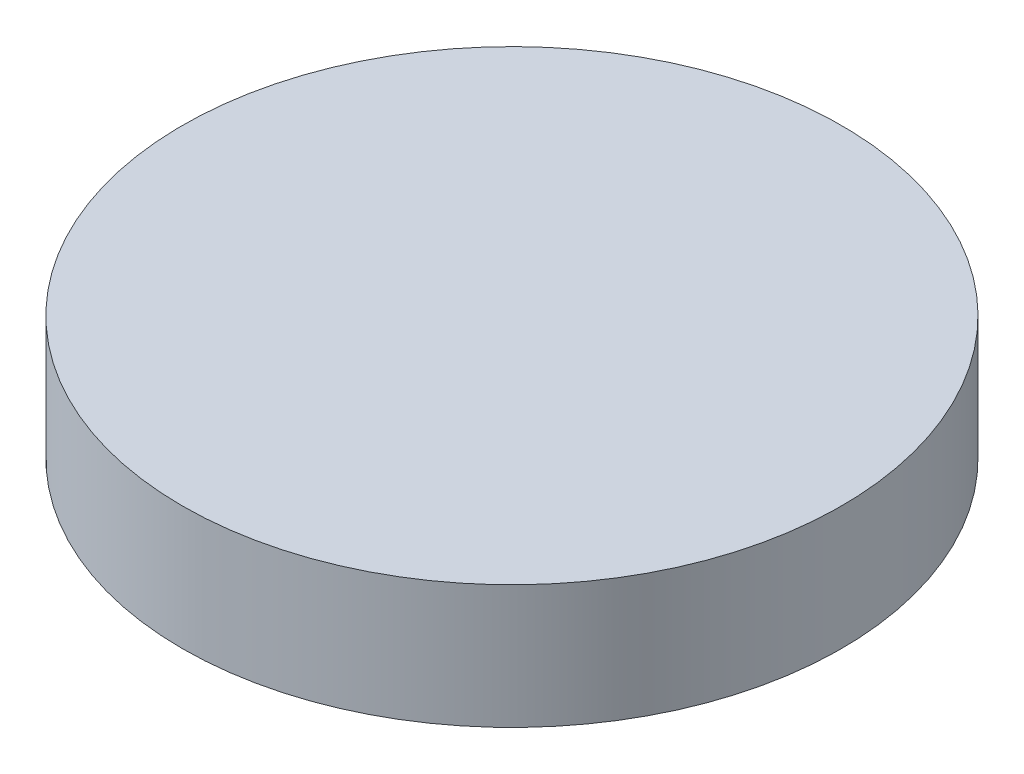
ISO-10303-21;
HEADER;
FILE_DESCRIPTION(('STEP AP214'),'2;1');
FILE_NAME('part.step','',(''),(''),'','','');
FILE_SCHEMA(('AUTOMOTIVE_DESIGN { 1 0 10303 214 1 1 1 1 }'));
ENDSEC;
DATA;
#1=APPLICATION_CONTEXT('core data for automotive mechanical design processes');
#2=APPLICATION_PROTOCOL_DEFINITION('international standard','automotive_design',2000,#1);
#3=PRODUCT_CONTEXT('',#1,'mechanical');
#4=PRODUCT('Part','Part','',(#3));
#5=PRODUCT_RELATED_PRODUCT_CATEGORY('part','',(#4));
#6=PRODUCT_DEFINITION_FORMATION('','',#4);
#7=PRODUCT_DEFINITION_CONTEXT('part definition',#1,'design');
#8=PRODUCT_DEFINITION('design','',#6,#7);
#9=PRODUCT_DEFINITION_SHAPE('','',#8);
#10=(LENGTH_UNIT() NAMED_UNIT(*) SI_UNIT(.MILLI.,.METRE.));
#11=(NAMED_UNIT(*) PLANE_ANGLE_UNIT() SI_UNIT($,.RADIAN.));
#12=(NAMED_UNIT(*) SI_UNIT($,.STERADIAN.) SOLID_ANGLE_UNIT());
#13=UNCERTAINTY_MEASURE_WITH_UNIT(LENGTH_MEASURE(1.E-05),#10,'distance_accuracy_value','');
#14=(GEOMETRIC_REPRESENTATION_CONTEXT(3) GLOBAL_UNCERTAINTY_ASSIGNED_CONTEXT((#13)) GLOBAL_UNIT_ASSIGNED_CONTEXT((#10,
#11,#12)) REPRESENTATION_CONTEXT('',''));
#15=CARTESIAN_POINT('',(0.,0.,0.));
#16=DIRECTION('',(0.,0.,1.));
#17=DIRECTION('',(1.,0.,0.));
#18=AXIS2_PLACEMENT_3D('',#15,#16,#17);
#19=CARTESIAN_POINT('',(0.,1.5,0.));
#20=DIRECTION('',(0.,-1.,0.));
#21=DIRECTION('',(0.,0.,-1.));
#22=AXIS2_PLACEMENT_3D('',#19,#20,#21);
#23=CYLINDRICAL_SURFACE('',#22,4.);
#24=CARTESIAN_POINT('',(0.,1.5,0.));
#25=DIRECTION('',(0.,1.,0.));
#26=DIRECTION('',(0.,0.,1.));
#27=AXIS2_PLACEMENT_3D('',#24,#25,#26);
#28=CIRCLE('',#27,4.);
#29=CARTESIAN_POINT('',(0.,1.5,4.));
#30=VERTEX_POINT('',#29);
#31=EDGE_CURVE('E10',#30,#30,#28,.T.);
#32=ORIENTED_EDGE('',*,*,#31,.F.);
#33=EDGE_LOOP('',(#32));
#34=FACE_BOUND('',#33,.T.);
#35=CARTESIAN_POINT('',(0.,0.,0.));
#36=DIRECTION('',(0.,1.,0.));
#37=DIRECTION('',(0.,0.,1.));
#38=AXIS2_PLACEMENT_3D('',#35,#36,#37);
#39=CIRCLE('',#38,4.);
#40=CARTESIAN_POINT('',(0.,0.,4.));
#41=VERTEX_POINT('',#40);
#42=EDGE_CURVE('E38',#41,#41,#39,.T.);
#43=ORIENTED_EDGE('',*,*,#42,.T.);
#44=EDGE_LOOP('',(#43));
#45=FACE_BOUND('',#44,.T.);
#46=ADVANCED_FACE('F35',(#34,#45),#23,.T.);
#47=CARTESIAN_POINT('',(0.,1.5,0.));
#48=DIRECTION('',(0.,1.,0.));
#49=DIRECTION('',(0.,0.,1.));
#50=AXIS2_PLACEMENT_3D('',#47,#48,#49);
#51=PLANE('',#50);
#52=ORIENTED_EDGE('',*,*,#31,.T.);
#53=EDGE_LOOP('',(#52));
#54=FACE_BOUND('',#53,.T.);
#55=ADVANCED_FACE('F50',(#54),#51,.T.);
#56=CARTESIAN_POINT('',(0.,0.,0.));
#57=DIRECTION('',(0.,1.,0.));
#58=DIRECTION('',(0.,0.,1.));
#59=AXIS2_PLACEMENT_3D('',#56,#57,#58);
#60=PLANE('',#59);
#61=ORIENTED_EDGE('',*,*,#42,.F.);
#62=EDGE_LOOP('',(#61));
#63=FACE_BOUND('',#62,.T.);
#64=ADVANCED_FACE('F48',(#63),#60,.F.);
#65=CLOSED_SHELL('',(#46,#55,#64));
#66=MANIFOLD_SOLID_BREP('B2',#65);
#67=ADVANCED_BREP_SHAPE_REPRESENTATION('',(#18,#66),#14);
#68=SHAPE_DEFINITION_REPRESENTATION(#9,#67);
ENDSEC;
END-ISO-10303-21;
